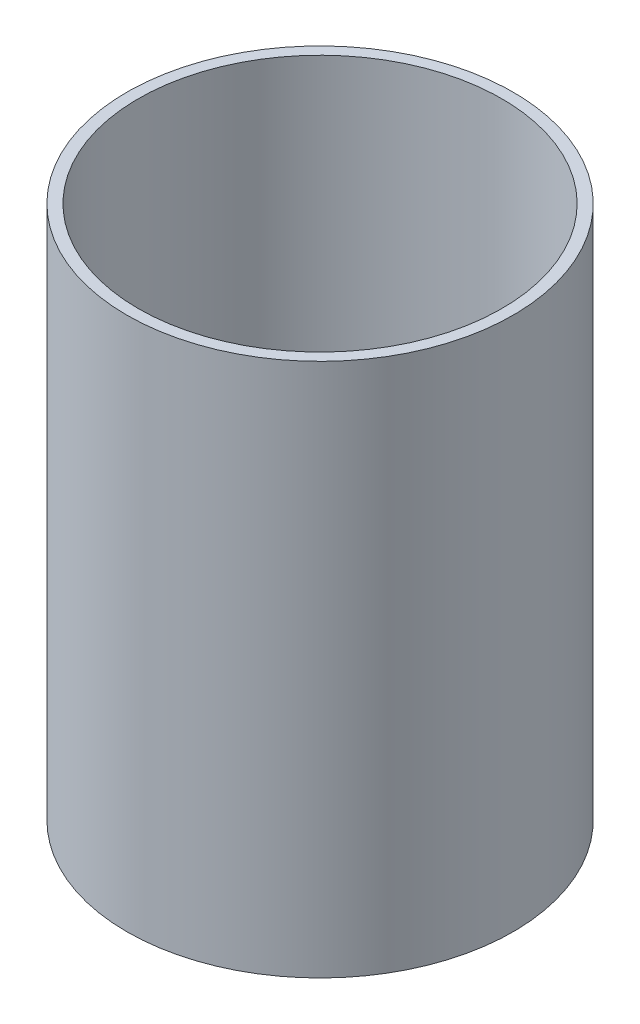
ISO-10303-21;
HEADER;
FILE_DESCRIPTION(('STEP AP214'),'2;1');
FILE_NAME('part.step','',(''),(''),'','','');
FILE_SCHEMA(('AUTOMOTIVE_DESIGN { 1 0 10303 214 1 1 1 1 }'));
ENDSEC;
DATA;
#1=APPLICATION_CONTEXT('core data for automotive mechanical design processes');
#2=APPLICATION_PROTOCOL_DEFINITION('international standard','automotive_design',2000,#1);
#3=PRODUCT_CONTEXT('',#1,'mechanical');
#4=PRODUCT('Part','Part','',(#3));
#5=PRODUCT_RELATED_PRODUCT_CATEGORY('part','',(#4));
#6=PRODUCT_DEFINITION_FORMATION('','',#4);
#7=PRODUCT_DEFINITION_CONTEXT('part definition',#1,'design');
#8=PRODUCT_DEFINITION('design','',#6,#7);
#9=PRODUCT_DEFINITION_SHAPE('','',#8);
#10=(LENGTH_UNIT() NAMED_UNIT(*) SI_UNIT(.MILLI.,.METRE.));
#11=(NAMED_UNIT(*) PLANE_ANGLE_UNIT() SI_UNIT($,.RADIAN.));
#12=(NAMED_UNIT(*) SI_UNIT($,.STERADIAN.) SOLID_ANGLE_UNIT());
#13=UNCERTAINTY_MEASURE_WITH_UNIT(LENGTH_MEASURE(1.E-05),#10,'distance_accuracy_value','');
#14=(GEOMETRIC_REPRESENTATION_CONTEXT(3) GLOBAL_UNCERTAINTY_ASSIGNED_CONTEXT((#13)) GLOBAL_UNIT_ASSIGNED_CONTEXT((#10,
#11,#12)) REPRESENTATION_CONTEXT('',''));
#15=CARTESIAN_POINT('',(0.,0.,0.));
#16=DIRECTION('',(0.,0.,1.));
#17=DIRECTION('',(1.,0.,0.));
#18=AXIS2_PLACEMENT_3D('',#15,#16,#17);
#19=CARTESIAN_POINT('',(0.,298.45,0.));
#20=DIRECTION('',(0.,1.,0.));
#21=DIRECTION('',(0.,0.,1.));
#22=AXIS2_PLACEMENT_3D('',#19,#20,#21);
#23=PLANE('',#22);
#24=CARTESIAN_POINT('',(0.,298.45,0.));
#25=DIRECTION('',(0.,1.,0.));
#26=DIRECTION('',(0.,0.,1.));
#27=AXIS2_PLACEMENT_3D('',#24,#25,#26);
#28=CIRCLE('',#27,107.95);
#29=CARTESIAN_POINT('',(0.,298.45,107.95));
#30=VERTEX_POINT('',#29);
#31=EDGE_CURVE('E10',#30,#30,#28,.T.);
#32=ORIENTED_EDGE('',*,*,#31,.T.);
#33=EDGE_LOOP('',(#32));
#34=FACE_BOUND('',#33,.T.);
#35=CARTESIAN_POINT('',(0.,298.45,0.));
#36=DIRECTION('',(0.,1.,0.));
#37=DIRECTION('',(0.,0.,1.));
#38=AXIS2_PLACEMENT_3D('',#35,#36,#37);
#39=CIRCLE('',#38,101.6);
#40=CARTESIAN_POINT('',(0.,298.45,101.6));
#41=VERTEX_POINT('',#40);
#42=EDGE_CURVE('E41',#41,#41,#39,.T.);
#43=ORIENTED_EDGE('',*,*,#42,.F.);
#44=EDGE_LOOP('',(#43));
#45=FACE_BOUND('',#44,.T.);
#46=ADVANCED_FACE('F30',(#34,#45),#23,.T.);
#47=CARTESIAN_POINT('',(0.,0.,0.));
#48=DIRECTION('',(0.,1.,0.));
#49=DIRECTION('',(0.,0.,1.));
#50=AXIS2_PLACEMENT_3D('',#47,#48,#49);
#51=PLANE('',#50);
#52=CARTESIAN_POINT('',(0.,0.,0.));
#53=DIRECTION('',(0.,1.,0.));
#54=DIRECTION('',(0.,0.,1.));
#55=AXIS2_PLACEMENT_3D('',#52,#53,#54);
#56=CIRCLE('',#55,107.95);
#57=CARTESIAN_POINT('',(0.,0.,107.95));
#58=VERTEX_POINT('',#57);
#59=EDGE_CURVE('E34',#58,#58,#56,.T.);
#60=ORIENTED_EDGE('',*,*,#59,.F.);
#61=EDGE_LOOP('',(#60));
#62=FACE_BOUND('',#61,.T.);
#63=CARTESIAN_POINT('',(0.,0.,0.));
#64=DIRECTION('',(0.,1.,0.));
#65=DIRECTION('',(0.,0.,1.));
#66=AXIS2_PLACEMENT_3D('',#63,#64,#65);
#67=CIRCLE('',#66,101.6);
#68=CARTESIAN_POINT('',(0.,0.,101.6));
#69=VERTEX_POINT('',#68);
#70=EDGE_CURVE('E43',#69,#69,#67,.T.);
#71=ORIENTED_EDGE('',*,*,#70,.T.);
#72=EDGE_LOOP('',(#71));
#73=FACE_BOUND('',#72,.T.);
#74=ADVANCED_FACE('F53',(#62,#73),#51,.F.);
#75=CARTESIAN_POINT('',(0.,298.45,0.));
#76=DIRECTION('',(0.,-1.,0.));
#77=DIRECTION('',(0.,0.,-1.));
#78=AXIS2_PLACEMENT_3D('',#75,#76,#77);
#79=CYLINDRICAL_SURFACE('',#78,107.95);
#80=ORIENTED_EDGE('',*,*,#31,.F.);
#81=EDGE_LOOP('',(#80));
#82=FACE_BOUND('',#81,.T.);
#83=ORIENTED_EDGE('',*,*,#59,.T.);
#84=EDGE_LOOP('',(#83));
#85=FACE_BOUND('',#84,.T.);
#86=ADVANCED_FACE('F32',(#82,#85),#79,.T.);
#87=CARTESIAN_POINT('',(0.,298.45,0.));
#88=DIRECTION('',(0.,-1.,0.));
#89=DIRECTION('',(0.,0.,-1.));
#90=AXIS2_PLACEMENT_3D('',#87,#88,#89);
#91=CYLINDRICAL_SURFACE('',#90,101.6);
#92=ORIENTED_EDGE('',*,*,#42,.T.);
#93=EDGE_LOOP('',(#92));
#94=FACE_BOUND('',#93,.T.);
#95=ORIENTED_EDGE('',*,*,#70,.F.);
#96=EDGE_LOOP('',(#95));
#97=FACE_BOUND('',#96,.T.);
#98=ADVANCED_FACE('F49',(#94,#97),#91,.F.);
#99=CLOSED_SHELL('',(#46,#74,#86,#98));
#100=MANIFOLD_SOLID_BREP('B2',#99);
#101=ADVANCED_BREP_SHAPE_REPRESENTATION('',(#18,#100),#14);
#102=SHAPE_DEFINITION_REPRESENTATION(#9,#101);
ENDSEC;
END-ISO-10303-21;
